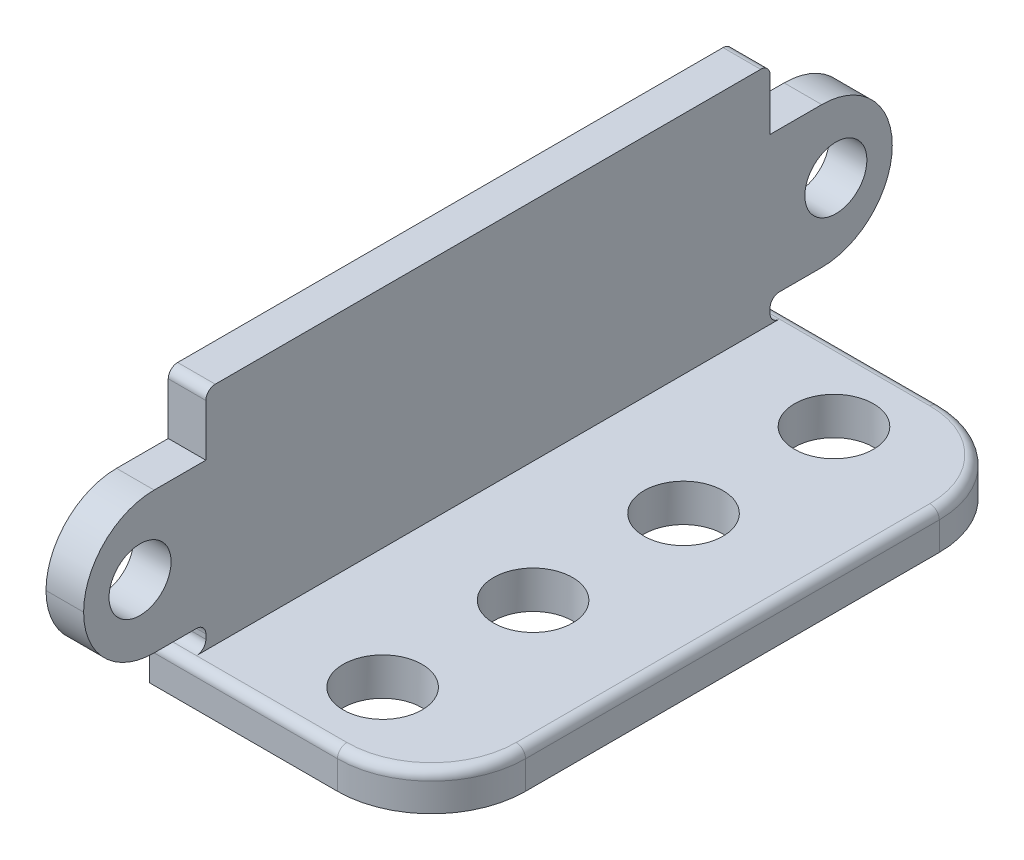
ISO-10303-21;
HEADER;
FILE_DESCRIPTION(('STEP AP214'),'2;1');
FILE_NAME('part.step','',(''),(''),'','','');
FILE_SCHEMA(('AUTOMOTIVE_DESIGN { 1 0 10303 214 1 1 1 1 }'));
ENDSEC;
DATA;
#1=APPLICATION_CONTEXT('core data for automotive mechanical design processes');
#2=APPLICATION_PROTOCOL_DEFINITION('international standard','automotive_design',2000,#1);
#3=PRODUCT_CONTEXT('',#1,'mechanical');
#4=PRODUCT('Part','Part','',(#3));
#5=PRODUCT_RELATED_PRODUCT_CATEGORY('part','',(#4));
#6=PRODUCT_DEFINITION_FORMATION('','',#4);
#7=PRODUCT_DEFINITION_CONTEXT('part definition',#1,'design');
#8=PRODUCT_DEFINITION('design','',#6,#7);
#9=PRODUCT_DEFINITION_SHAPE('','',#8);
#10=(LENGTH_UNIT() NAMED_UNIT(*) SI_UNIT(.MILLI.,.METRE.));
#11=(NAMED_UNIT(*) PLANE_ANGLE_UNIT() SI_UNIT($,.RADIAN.));
#12=(NAMED_UNIT(*) SI_UNIT($,.STERADIAN.) SOLID_ANGLE_UNIT());
#13=UNCERTAINTY_MEASURE_WITH_UNIT(LENGTH_MEASURE(1.E-05),#10,'distance_accuracy_value','');
#14=(GEOMETRIC_REPRESENTATION_CONTEXT(3) GLOBAL_UNCERTAINTY_ASSIGNED_CONTEXT((#13)) GLOBAL_UNIT_ASSIGNED_CONTEXT((#10,
#11,#12)) REPRESENTATION_CONTEXT('',''));
#15=CARTESIAN_POINT('',(0.,0.,0.));
#16=DIRECTION('',(0.,0.,1.));
#17=DIRECTION('',(1.,0.,0.));
#18=AXIS2_PLACEMENT_3D('',#15,#16,#17);
#19=CARTESIAN_POINT('',(2.,3.75,21.5));
#20=DIRECTION('',(0.,-1.,0.));
#21=DIRECTION('',(0.,0.,-1.));
#22=AXIS2_PLACEMENT_3D('',#19,#20,#21);
#23=PLANE('',#22);
#24=DIRECTION('',(0.,0.,1.));
#25=VECTOR('',#24,1.);
#26=CARTESIAN_POINT('',(0.,3.75,21.5));
#27=LINE('',#26,#25);
#28=CARTESIAN_POINT('',(0.,3.75,-17.75));
#29=VERTEX_POINT('',#28);
#30=CARTESIAN_POINT('',(0.,3.75,-15.));
#31=VERTEX_POINT('',#30);
#32=EDGE_CURVE('E332',#29,#31,#27,.T.);
#33=ORIENTED_EDGE('',*,*,#32,.T.);
#34=DIRECTION('',(1.,0.,0.));
#35=VECTOR('',#34,1.);
#36=CARTESIAN_POINT('',(2.,3.75,-15.));
#37=LINE('',#36,#35);
#38=CARTESIAN_POINT('',(2.,3.75,-15.));
#39=VERTEX_POINT('',#38);
#40=EDGE_CURVE('E305',#31,#39,#37,.T.);
#41=ORIENTED_EDGE('',*,*,#40,.T.);
#42=DIRECTION('',(0.,0.,1.));
#43=VECTOR('',#42,1.);
#44=CARTESIAN_POINT('',(2.,3.75,21.5));
#45=LINE('',#44,#43);
#46=CARTESIAN_POINT('',(2.,3.75,-17.75));
#47=VERTEX_POINT('',#46);
#48=EDGE_CURVE('E321',#47,#39,#45,.T.);
#49=ORIENTED_EDGE('',*,*,#48,.F.);
#50=DIRECTION('',(-1.,0.,0.));
#51=VECTOR('',#50,1.);
#52=CARTESIAN_POINT('',(2.,3.75,-17.75));
#53=LINE('',#52,#51);
#54=EDGE_CURVE('E385',#47,#29,#53,.T.);
#55=ORIENTED_EDGE('',*,*,#54,.T.);
#56=EDGE_LOOP('',(#33,#41,#49,#55));
#57=FACE_BOUND('',#56,.T.);
#58=ADVANCED_FACE('F39',(#57),#23,.F.);
#59=CARTESIAN_POINT('',(2.,-3.75,21.5));
#60=DIRECTION('',(0.,1.,0.));
#61=DIRECTION('',(0.,0.,1.));
#62=AXIS2_PLACEMENT_3D('',#59,#60,#61);
#63=PLANE('',#62);
#64=DIRECTION('',(0.,0.,-1.));
#65=VECTOR('',#64,1.);
#66=CARTESIAN_POINT('',(2.,-3.75,21.5));
#67=LINE('',#66,#65);
#68=CARTESIAN_POINT('',(2.,-3.75,-15.5));
#69=VERTEX_POINT('',#68);
#70=CARTESIAN_POINT('',(2.,-3.75,-17.75));
#71=VERTEX_POINT('',#70);
#72=EDGE_CURVE('E325',#69,#71,#67,.T.);
#73=ORIENTED_EDGE('',*,*,#72,.F.);
#74=DIRECTION('',(-1.,0.,0.));
#75=VECTOR('',#74,1.);
#76=CARTESIAN_POINT('',(2.,-3.75,-15.5));
#77=LINE('',#76,#75);
#78=CARTESIAN_POINT('',(0.,-3.75,-15.5));
#79=VERTEX_POINT('',#78);
#80=EDGE_CURVE('E426',#69,#79,#77,.T.);
#81=ORIENTED_EDGE('',*,*,#80,.T.);
#82=DIRECTION('',(0.,0.,-1.));
#83=VECTOR('',#82,1.);
#84=CARTESIAN_POINT('',(0.,-3.75,21.5));
#85=LINE('',#84,#83);
#86=CARTESIAN_POINT('',(0.,-3.75,-17.75));
#87=VERTEX_POINT('',#86);
#88=EDGE_CURVE('E336',#79,#87,#85,.T.);
#89=ORIENTED_EDGE('',*,*,#88,.T.);
#90=DIRECTION('',(-1.,0.,0.));
#91=VECTOR('',#90,1.);
#92=CARTESIAN_POINT('',(2.,-3.75,-17.75));
#93=LINE('',#92,#91);
#94=EDGE_CURVE('E365',#87,#71,#93,.F.);
#95=ORIENTED_EDGE('',*,*,#94,.T.);
#96=EDGE_LOOP('',(#73,#81,#89,#95));
#97=FACE_BOUND('',#96,.T.);
#98=ADVANCED_FACE('F664',(#97),#63,.F.);
#99=CARTESIAN_POINT('',(2.,3.75,15.));
#100=VERTEX_POINT('',#99);
#101=CARTESIAN_POINT('',(2.,3.75,17.75));
#102=VERTEX_POINT('',#101);
#103=EDGE_CURVE('E326',#100,#102,#45,.T.);
#104=ORIENTED_EDGE('',*,*,#103,.F.);
#105=DIRECTION('',(-1.,0.,0.));
#106=VECTOR('',#105,1.);
#107=CARTESIAN_POINT('',(2.,3.75,15.));
#108=LINE('',#107,#106);
#109=CARTESIAN_POINT('',(0.,3.75,15.));
#110=VERTEX_POINT('',#109);
#111=EDGE_CURVE('E291',#100,#110,#108,.T.);
#112=ORIENTED_EDGE('',*,*,#111,.T.);
#113=CARTESIAN_POINT('',(0.,3.75,17.75));
#114=VERTEX_POINT('',#113);
#115=EDGE_CURVE('E337',#110,#114,#27,.T.);
#116=ORIENTED_EDGE('',*,*,#115,.T.);
#117=DIRECTION('',(-1.,0.,0.));
#118=VECTOR('',#117,1.);
#119=CARTESIAN_POINT('',(2.,3.75,17.75));
#120=LINE('',#119,#118);
#121=EDGE_CURVE('E381',#114,#102,#120,.F.);
#122=ORIENTED_EDGE('',*,*,#121,.T.);
#123=EDGE_LOOP('',(#104,#112,#116,#122));
#124=FACE_BOUND('',#123,.T.);
#125=ADVANCED_FACE('F658',(#124),#23,.F.);
#126=CARTESIAN_POINT('',(0.,-3.75,17.75));
#127=VERTEX_POINT('',#126);
#128=CARTESIAN_POINT('',(0.,-3.75,15.5));
#129=VERTEX_POINT('',#128);
#130=EDGE_CURVE('E338',#127,#129,#85,.T.);
#131=ORIENTED_EDGE('',*,*,#130,.T.);
#132=DIRECTION('',(1.,0.,0.));
#133=VECTOR('',#132,1.);
#134=CARTESIAN_POINT('',(2.,-3.75,15.5));
#135=LINE('',#134,#133);
#136=CARTESIAN_POINT('',(2.,-3.75,15.5));
#137=VERTEX_POINT('',#136);
#138=EDGE_CURVE('E430',#129,#137,#135,.T.);
#139=ORIENTED_EDGE('',*,*,#138,.T.);
#140=CARTESIAN_POINT('',(2.,-3.75,17.75));
#141=VERTEX_POINT('',#140);
#142=EDGE_CURVE('E327',#141,#137,#67,.T.);
#143=ORIENTED_EDGE('',*,*,#142,.F.);
#144=DIRECTION('',(-1.,0.,0.));
#145=VECTOR('',#144,1.);
#146=CARTESIAN_POINT('',(2.,-3.75,17.75));
#147=LINE('',#146,#145);
#148=EDGE_CURVE('E361',#141,#127,#147,.T.);
#149=ORIENTED_EDGE('',*,*,#148,.T.);
#150=EDGE_LOOP('',(#131,#139,#143,#149));
#151=FACE_BOUND('',#150,.T.);
#152=ADVANCED_FACE('F645',(#151),#63,.F.);
#153=CARTESIAN_POINT('',(2.,0.,0.));
#154=DIRECTION('',(1.,0.,0.));
#155=DIRECTION('',(0.,0.,-1.));
#156=AXIS2_PLACEMENT_3D('',#153,#154,#155);
#157=PLANE('',#156);
#158=DIRECTION('',(0.,0.,-1.));
#159=VECTOR('',#158,1.);
#160=CARTESIAN_POINT('',(2.,7.,15.));
#161=LINE('',#160,#159);
#162=CARTESIAN_POINT('',(2.,7.,14.5));
#163=VERTEX_POINT('',#162);
#164=CARTESIAN_POINT('',(2.,7.,-14.5));
#165=VERTEX_POINT('',#164);
#166=EDGE_CURVE('E288',#163,#165,#161,.T.);
#167=ORIENTED_EDGE('',*,*,#166,.F.);
#168=CARTESIAN_POINT('',(2.,6.5,14.5));
#169=DIRECTION('',(1.,0.,0.));
#170=DIRECTION('',(0.,0.,-1.));
#171=AXIS2_PLACEMENT_3D('',#168,#169,#170);
#172=CIRCLE('',#171,0.5);
#173=CARTESIAN_POINT('',(2.,6.5,15.));
#174=VERTEX_POINT('',#173);
#175=EDGE_CURVE('E48',#163,#174,#172,.T.);
#176=ORIENTED_EDGE('',*,*,#175,.T.);
#177=DIRECTION('',(0.,1.,0.));
#178=VECTOR('',#177,1.);
#179=CARTESIAN_POINT('',(2.,-7.,15.));
#180=LINE('',#179,#178);
#181=EDGE_CURVE('E282',#100,#174,#180,.T.);
#182=ORIENTED_EDGE('',*,*,#181,.F.);
#183=ORIENTED_EDGE('',*,*,#103,.T.);
#184=CARTESIAN_POINT('',(2.,0.,17.75));
#185=DIRECTION('',(1.,0.,0.));
#186=DIRECTION('',(0.,0.,-1.));
#187=AXIS2_PLACEMENT_3D('',#184,#185,#186);
#188=CIRCLE('',#187,3.75);
#189=CARTESIAN_POINT('',(2.,0.,21.5));
#190=VERTEX_POINT('',#189);
#191=EDGE_CURVE('E369',#102,#190,#188,.T.);
#192=ORIENTED_EDGE('',*,*,#191,.T.);
#193=CARTESIAN_POINT('',(2.,0.,17.75));
#194=DIRECTION('',(1.,0.,0.));
#195=DIRECTION('',(0.,0.,-1.));
#196=AXIS2_PLACEMENT_3D('',#193,#194,#195);
#197=CIRCLE('',#196,3.75);
#198=EDGE_CURVE('E372',#190,#141,#197,.T.);
#199=ORIENTED_EDGE('',*,*,#198,.T.);
#200=ORIENTED_EDGE('',*,*,#142,.T.);
#201=CARTESIAN_POINT('',(2.,-4.25,15.5));
#202=DIRECTION('',(1.,0.,0.));
#203=DIRECTION('',(0.,0.,-1.));
#204=AXIS2_PLACEMENT_3D('',#201,#202,#203);
#205=CIRCLE('',#204,0.5);
#206=CARTESIAN_POINT('',(2.,-4.25,15.));
#207=VERTEX_POINT('',#206);
#208=EDGE_CURVE('E452',#137,#207,#205,.F.);
#209=ORIENTED_EDGE('',*,*,#208,.T.);
#210=CARTESIAN_POINT('',(2.,-4.5,15.));
#211=VERTEX_POINT('',#210);
#212=EDGE_CURVE('E284',#211,#207,#180,.T.);
#213=ORIENTED_EDGE('',*,*,#212,.F.);
#214=CARTESIAN_POINT('',(2.,-4.5,15.5));
#215=DIRECTION('',(1.,0.,0.));
#216=DIRECTION('',(0.,0.,-1.));
#217=AXIS2_PLACEMENT_3D('',#214,#215,#216);
#218=CIRCLE('',#217,0.5);
#219=CARTESIAN_POINT('',(2.,-5.,15.5));
#220=VERTEX_POINT('',#219);
#221=EDGE_CURVE('E461',#211,#220,#218,.F.);
#222=ORIENTED_EDGE('',*,*,#221,.T.);
#223=DIRECTION('',(0.,0.,1.));
#224=VECTOR('',#223,1.);
#225=CARTESIAN_POINT('',(2.,-5.,0.));
#226=LINE('',#225,#224);
#227=CARTESIAN_POINT('',(2.,-5.,-15.5));
#228=VERTEX_POINT('',#227);
#229=EDGE_CURVE('E237',#228,#220,#226,.T.);
#230=ORIENTED_EDGE('',*,*,#229,.F.);
#231=CARTESIAN_POINT('',(2.,-4.5,-15.5));
#232=DIRECTION('',(1.,0.,0.));
#233=DIRECTION('',(0.,0.,-1.));
#234=AXIS2_PLACEMENT_3D('',#231,#232,#233);
#235=CIRCLE('',#234,0.5);
#236=CARTESIAN_POINT('',(2.,-4.5,-15.));
#237=VERTEX_POINT('',#236);
#238=EDGE_CURVE('E440',#228,#237,#235,.F.);
#239=ORIENTED_EDGE('',*,*,#238,.T.);
#240=DIRECTION('',(0.,-1.,0.));
#241=VECTOR('',#240,1.);
#242=CARTESIAN_POINT('',(2.,-7.,-15.));
#243=LINE('',#242,#241);
#244=CARTESIAN_POINT('',(2.,-4.25,-15.));
#245=VERTEX_POINT('',#244);
#246=EDGE_CURVE('E283',#245,#237,#243,.T.);
#247=ORIENTED_EDGE('',*,*,#246,.F.);
#248=CARTESIAN_POINT('',(2.,-4.25,-15.5));
#249=DIRECTION('',(1.,0.,0.));
#250=DIRECTION('',(0.,0.,-1.));
#251=AXIS2_PLACEMENT_3D('',#248,#249,#250);
#252=CIRCLE('',#251,0.5);
#253=EDGE_CURVE('E449',#245,#69,#252,.F.);
#254=ORIENTED_EDGE('',*,*,#253,.T.);
#255=ORIENTED_EDGE('',*,*,#72,.T.);
#256=CARTESIAN_POINT('',(2.,0.,-17.75));
#257=DIRECTION('',(1.,0.,0.));
#258=DIRECTION('',(0.,0.,-1.));
#259=AXIS2_PLACEMENT_3D('',#256,#257,#258);
#260=CIRCLE('',#259,3.75);
#261=CARTESIAN_POINT('',(2.,0.,-21.5));
#262=VERTEX_POINT('',#261);
#263=EDGE_CURVE('E378',#71,#262,#260,.T.);
#264=ORIENTED_EDGE('',*,*,#263,.T.);
#265=CARTESIAN_POINT('',(2.,0.,-17.75));
#266=DIRECTION('',(1.,0.,0.));
#267=DIRECTION('',(0.,0.,-1.));
#268=AXIS2_PLACEMENT_3D('',#265,#266,#267);
#269=CIRCLE('',#268,3.75);
#270=EDGE_CURVE('E375',#262,#47,#269,.T.);
#271=ORIENTED_EDGE('',*,*,#270,.T.);
#272=ORIENTED_EDGE('',*,*,#48,.T.);
#273=CARTESIAN_POINT('',(2.,6.5,-15.));
#274=VERTEX_POINT('',#273);
#275=EDGE_CURVE('E279',#274,#39,#243,.T.);
#276=ORIENTED_EDGE('',*,*,#275,.F.);
#277=CARTESIAN_POINT('',(2.,6.5,-14.5));
#278=DIRECTION('',(1.,0.,0.));
#279=DIRECTION('',(0.,0.,-1.));
#280=AXIS2_PLACEMENT_3D('',#277,#278,#279);
#281=CIRCLE('',#280,0.5);
#282=EDGE_CURVE('E60',#274,#165,#281,.T.);
#283=ORIENTED_EDGE('',*,*,#282,.T.);
#284=EDGE_LOOP('',(#167,#176,#182,#183,#192,#199,#200,#209,#213,#222,#230,#239,#247,#254,#255,
#264,#271,#272,#276,#283));
#285=FACE_BOUND('',#284,.T.);
#286=CARTESIAN_POINT('',(2.,0.,18.5));
#287=DIRECTION('',(1.,0.,0.));
#288=DIRECTION('',(0.,0.,-1.));
#289=AXIS2_PLACEMENT_3D('',#286,#287,#288);
#290=CIRCLE('',#289,1.65);
#291=CARTESIAN_POINT('',(2.,0.,16.85));
#292=VERTEX_POINT('',#291);
#293=EDGE_CURVE('E316',#292,#292,#290,.T.);
#294=ORIENTED_EDGE('',*,*,#293,.F.);
#295=EDGE_LOOP('',(#294));
#296=FACE_BOUND('',#295,.T.);
#297=CARTESIAN_POINT('',(2.,0.,-18.5));
#298=DIRECTION('',(1.,0.,0.));
#299=DIRECTION('',(0.,0.,-1.));
#300=AXIS2_PLACEMENT_3D('',#297,#298,#299);
#301=CIRCLE('',#300,1.65);
#302=CARTESIAN_POINT('',(2.,0.,-20.15));
#303=VERTEX_POINT('',#302);
#304=EDGE_CURVE('E310',#303,#303,#301,.T.);
#305=ORIENTED_EDGE('',*,*,#304,.F.);
#306=EDGE_LOOP('',(#305));
#307=FACE_BOUND('',#306,.T.);
#308=ADVANCED_FACE('F539',(#285,#296,#307),#157,.T.);
#309=CARTESIAN_POINT('',(0.,0.,0.));
#310=DIRECTION('',(1.,0.,0.));
#311=DIRECTION('',(0.,0.,-1.));
#312=AXIS2_PLACEMENT_3D('',#309,#310,#311);
#313=PLANE('',#312);
#314=CARTESIAN_POINT('',(0.,0.,18.5));
#315=DIRECTION('',(1.,0.,0.));
#316=DIRECTION('',(0.,0.,-1.));
#317=AXIS2_PLACEMENT_3D('',#314,#315,#316);
#318=CIRCLE('',#317,1.65);
#319=CARTESIAN_POINT('',(0.,0.,16.85));
#320=VERTEX_POINT('',#319);
#321=EDGE_CURVE('E320',#320,#320,#318,.T.);
#322=ORIENTED_EDGE('',*,*,#321,.T.);
#323=EDGE_LOOP('',(#322));
#324=FACE_BOUND('',#323,.T.);
#325=DIRECTION('',(0.,1.,0.));
#326=VECTOR('',#325,1.);
#327=CARTESIAN_POINT('',(0.,-7.,15.));
#328=LINE('',#327,#326);
#329=CARTESIAN_POINT('',(0.,6.5,15.));
#330=VERTEX_POINT('',#329);
#331=EDGE_CURVE('E250',#110,#330,#328,.T.);
#332=ORIENTED_EDGE('',*,*,#331,.T.);
#333=CARTESIAN_POINT('',(0.,6.5,14.5));
#334=DIRECTION('',(1.,0.,0.));
#335=DIRECTION('',(0.,0.,-1.));
#336=AXIS2_PLACEMENT_3D('',#333,#334,#335);
#337=CIRCLE('',#336,0.5);
#338=CARTESIAN_POINT('',(0.,7.,14.5));
#339=VERTEX_POINT('',#338);
#340=EDGE_CURVE('E524',#330,#339,#337,.F.);
#341=ORIENTED_EDGE('',*,*,#340,.T.);
#342=DIRECTION('',(0.,0.,-1.));
#343=VECTOR('',#342,1.);
#344=CARTESIAN_POINT('',(0.,7.,15.));
#345=LINE('',#344,#343);
#346=CARTESIAN_POINT('',(0.,7.,-14.5));
#347=VERTEX_POINT('',#346);
#348=EDGE_CURVE('E298',#339,#347,#345,.T.);
#349=ORIENTED_EDGE('',*,*,#348,.T.);
#350=CARTESIAN_POINT('',(0.,6.5,-14.5));
#351=DIRECTION('',(1.,0.,0.));
#352=DIRECTION('',(0.,0.,-1.));
#353=AXIS2_PLACEMENT_3D('',#350,#351,#352);
#354=CIRCLE('',#353,0.5);
#355=CARTESIAN_POINT('',(0.,6.5,-15.));
#356=VERTEX_POINT('',#355);
#357=EDGE_CURVE('E521',#347,#356,#354,.F.);
#358=ORIENTED_EDGE('',*,*,#357,.T.);
#359=DIRECTION('',(0.,-1.,0.));
#360=VECTOR('',#359,1.);
#361=CARTESIAN_POINT('',(0.,-7.,-15.));
#362=LINE('',#361,#360);
#363=EDGE_CURVE('E251',#356,#31,#362,.T.);
#364=ORIENTED_EDGE('',*,*,#363,.T.);
#365=ORIENTED_EDGE('',*,*,#32,.F.);
#366=CARTESIAN_POINT('',(0.,0.,-17.75));
#367=DIRECTION('',(1.,0.,0.));
#368=DIRECTION('',(0.,0.,-1.));
#369=AXIS2_PLACEMENT_3D('',#366,#367,#368);
#370=CIRCLE('',#369,3.75);
#371=CARTESIAN_POINT('',(0.,0.,-21.5));
#372=VERTEX_POINT('',#371);
#373=EDGE_CURVE('E354',#29,#372,#370,.F.);
#374=ORIENTED_EDGE('',*,*,#373,.T.);
#375=CARTESIAN_POINT('',(0.,0.,-17.75));
#376=DIRECTION('',(1.,0.,0.));
#377=DIRECTION('',(0.,0.,-1.));
#378=AXIS2_PLACEMENT_3D('',#375,#376,#377);
#379=CIRCLE('',#378,3.75);
#380=EDGE_CURVE('E357',#372,#87,#379,.F.);
#381=ORIENTED_EDGE('',*,*,#380,.T.);
#382=ORIENTED_EDGE('',*,*,#88,.F.);
#383=CARTESIAN_POINT('',(0.,-4.25,-15.5));
#384=DIRECTION('',(1.,0.,0.));
#385=DIRECTION('',(0.,0.,-1.));
#386=AXIS2_PLACEMENT_3D('',#383,#384,#385);
#387=CIRCLE('',#386,0.5);
#388=CARTESIAN_POINT('',(0.,-4.25,-15.));
#389=VERTEX_POINT('',#388);
#390=EDGE_CURVE('E446',#79,#389,#387,.T.);
#391=ORIENTED_EDGE('',*,*,#390,.T.);
#392=CARTESIAN_POINT('',(0.,-4.5,-15.));
#393=VERTEX_POINT('',#392);
#394=EDGE_CURVE('E278',#389,#393,#362,.T.);
#395=ORIENTED_EDGE('',*,*,#394,.T.);
#396=CARTESIAN_POINT('',(0.,-4.5,-15.5));
#397=DIRECTION('',(1.,0.,0.));
#398=DIRECTION('',(0.,0.,-1.));
#399=AXIS2_PLACEMENT_3D('',#396,#397,#398);
#400=CIRCLE('',#399,0.5);
#401=CARTESIAN_POINT('',(0.,-5.,-15.5));
#402=VERTEX_POINT('',#401);
#403=EDGE_CURVE('E443',#393,#402,#400,.T.);
#404=ORIENTED_EDGE('',*,*,#403,.T.);
#405=CARTESIAN_POINT('',(0.,-5.5,-15.5));
#406=DIRECTION('',(1.,0.,0.));
#407=DIRECTION('',(0.,0.,-1.));
#408=AXIS2_PLACEMENT_3D('',#405,#406,#407);
#409=CIRCLE('',#408,0.5);
#410=CARTESIAN_POINT('',(0.,-5.5,-16.));
#411=VERTEX_POINT('',#410);
#412=EDGE_CURVE('E482',#402,#411,#409,.F.);
#413=ORIENTED_EDGE('',*,*,#412,.T.);
#414=DIRECTION('',(0.,-1.,0.));
#415=VECTOR('',#414,1.);
#416=CARTESIAN_POINT('',(0.,-5.,-16.));
#417=LINE('',#416,#415);
#418=CARTESIAN_POINT('',(0.,-7.,-16.));
#419=VERTEX_POINT('',#418);
#420=EDGE_CURVE('E238',#411,#419,#417,.T.);
#421=ORIENTED_EDGE('',*,*,#420,.T.);
#422=DIRECTION('',(0.,0.,1.));
#423=VECTOR('',#422,1.);
#424=CARTESIAN_POINT('',(0.,-7.,15.));
#425=LINE('',#424,#423);
#426=CARTESIAN_POINT('',(0.,-7.,16.));
#427=VERTEX_POINT('',#426);
#428=EDGE_CURVE('E241',#419,#427,#425,.T.);
#429=ORIENTED_EDGE('',*,*,#428,.T.);
#430=DIRECTION('',(0.,-1.,0.));
#431=VECTOR('',#430,1.);
#432=CARTESIAN_POINT('',(0.,-5.,16.));
#433=LINE('',#432,#431);
#434=CARTESIAN_POINT('',(0.,-5.5,16.));
#435=VERTEX_POINT('',#434);
#436=EDGE_CURVE('E225',#435,#427,#433,.T.);
#437=ORIENTED_EDGE('',*,*,#436,.F.);
#438=CARTESIAN_POINT('',(0.,-5.5,15.5));
#439=DIRECTION('',(1.,0.,0.));
#440=DIRECTION('',(0.,0.,-1.));
#441=AXIS2_PLACEMENT_3D('',#438,#439,#440);
#442=CIRCLE('',#441,0.5);
#443=CARTESIAN_POINT('',(0.,-5.,15.5));
#444=VERTEX_POINT('',#443);
#445=EDGE_CURVE('E485',#435,#444,#442,.F.);
#446=ORIENTED_EDGE('',*,*,#445,.T.);
#447=CARTESIAN_POINT('',(0.,-4.5,15.5));
#448=DIRECTION('',(1.,0.,0.));
#449=DIRECTION('',(0.,0.,-1.));
#450=AXIS2_PLACEMENT_3D('',#447,#448,#449);
#451=CIRCLE('',#450,0.5);
#452=CARTESIAN_POINT('',(0.,-4.5,15.));
#453=VERTEX_POINT('',#452);
#454=EDGE_CURVE('E458',#444,#453,#451,.T.);
#455=ORIENTED_EDGE('',*,*,#454,.T.);
#456=CARTESIAN_POINT('',(0.,-4.25,15.));
#457=VERTEX_POINT('',#456);
#458=EDGE_CURVE('E294',#453,#457,#328,.T.);
#459=ORIENTED_EDGE('',*,*,#458,.T.);
#460=CARTESIAN_POINT('',(0.,-4.25,15.5));
#461=DIRECTION('',(1.,0.,0.));
#462=DIRECTION('',(0.,0.,-1.));
#463=AXIS2_PLACEMENT_3D('',#460,#461,#462);
#464=CIRCLE('',#463,0.5);
#465=EDGE_CURVE('E455',#457,#129,#464,.T.);
#466=ORIENTED_EDGE('',*,*,#465,.T.);
#467=ORIENTED_EDGE('',*,*,#130,.F.);
#468=CARTESIAN_POINT('',(0.,0.,17.75));
#469=DIRECTION('',(1.,0.,0.));
#470=DIRECTION('',(0.,0.,-1.));
#471=AXIS2_PLACEMENT_3D('',#468,#469,#470);
#472=CIRCLE('',#471,3.75);
#473=CARTESIAN_POINT('',(0.,0.,21.5));
#474=VERTEX_POINT('',#473);
#475=EDGE_CURVE('E351',#127,#474,#472,.F.);
#476=ORIENTED_EDGE('',*,*,#475,.T.);
#477=CARTESIAN_POINT('',(0.,0.,17.75));
#478=DIRECTION('',(1.,0.,0.));
#479=DIRECTION('',(0.,0.,-1.));
#480=AXIS2_PLACEMENT_3D('',#477,#478,#479);
#481=CIRCLE('',#480,3.75);
#482=EDGE_CURVE('E331',#474,#114,#481,.F.);
#483=ORIENTED_EDGE('',*,*,#482,.T.);
#484=ORIENTED_EDGE('',*,*,#115,.F.);
#485=EDGE_LOOP('',(#332,#341,#349,#358,#364,#365,#374,#381,#382,#391,#395,#404,#413,#421,#429,
#437,#446,#455,#459,#466,#467,#476,#483,#484));
#486=FACE_BOUND('',#485,.T.);
#487=CARTESIAN_POINT('',(0.,0.,-18.5));
#488=DIRECTION('',(1.,0.,0.));
#489=DIRECTION('',(0.,0.,-1.));
#490=AXIS2_PLACEMENT_3D('',#487,#488,#489);
#491=CIRCLE('',#490,1.65);
#492=CARTESIAN_POINT('',(0.,0.,-20.15));
#493=VERTEX_POINT('',#492);
#494=EDGE_CURVE('E314',#493,#493,#491,.T.);
#495=ORIENTED_EDGE('',*,*,#494,.T.);
#496=EDGE_LOOP('',(#495));
#497=FACE_BOUND('',#496,.T.);
#498=ADVANCED_FACE('F243',(#324,#486,#497),#313,.F.);
#499=CARTESIAN_POINT('',(-9.5,0.,18.5));
#500=DIRECTION('',(1.,0.,0.));
#501=DIRECTION('',(0.,0.,-1.));
#502=AXIS2_PLACEMENT_3D('',#499,#500,#501);
#503=CYLINDRICAL_SURFACE('',#502,1.65);
#504=ORIENTED_EDGE('',*,*,#293,.T.);
#505=EDGE_LOOP('',(#504));
#506=FACE_BOUND('',#505,.T.);
#507=ORIENTED_EDGE('',*,*,#321,.F.);
#508=EDGE_LOOP('',(#507));
#509=FACE_BOUND('',#508,.T.);
#510=ADVANCED_FACE('F694',(#506,#509),#503,.F.);
#511=CARTESIAN_POINT('',(-9.5,0.,-18.5));
#512=DIRECTION('',(1.,0.,0.));
#513=DIRECTION('',(0.,0.,-1.));
#514=AXIS2_PLACEMENT_3D('',#511,#512,#513);
#515=CYLINDRICAL_SURFACE('',#514,1.65);
#516=ORIENTED_EDGE('',*,*,#304,.T.);
#517=EDGE_LOOP('',(#516));
#518=FACE_BOUND('',#517,.T.);
#519=ORIENTED_EDGE('',*,*,#494,.F.);
#520=EDGE_LOOP('',(#519));
#521=FACE_BOUND('',#520,.T.);
#522=ADVANCED_FACE('F698',(#518,#521),#515,.F.);
#523=CARTESIAN_POINT('',(2.,0.,-17.75));
#524=DIRECTION('',(-1.,0.,0.));
#525=DIRECTION('',(0.,0.,1.));
#526=AXIS2_PLACEMENT_3D('',#523,#524,#525);
#527=CYLINDRICAL_SURFACE('',#526,3.75);
#528=ORIENTED_EDGE('',*,*,#54,.F.);
#529=ORIENTED_EDGE('',*,*,#270,.F.);
#530=DIRECTION('',(-1.,0.,0.));
#531=VECTOR('',#530,1.);
#532=CARTESIAN_POINT('',(2.,0.,-21.5));
#533=LINE('',#532,#531);
#534=EDGE_CURVE('E315',#372,#262,#533,.F.);
#535=ORIENTED_EDGE('',*,*,#534,.F.);
#536=ORIENTED_EDGE('',*,*,#373,.F.);
#537=EDGE_LOOP('',(#528,#529,#535,#536));
#538=FACE_BOUND('',#537,.T.);
#539=ADVANCED_FACE('F565',(#538),#527,.T.);
#540=CARTESIAN_POINT('',(2.,0.,-17.75));
#541=DIRECTION('',(-1.,0.,0.));
#542=DIRECTION('',(0.,0.,1.));
#543=AXIS2_PLACEMENT_3D('',#540,#541,#542);
#544=CYLINDRICAL_SURFACE('',#543,3.75);
#545=ORIENTED_EDGE('',*,*,#263,.F.);
#546=ORIENTED_EDGE('',*,*,#94,.F.);
#547=ORIENTED_EDGE('',*,*,#380,.F.);
#548=ORIENTED_EDGE('',*,*,#534,.T.);
#549=EDGE_LOOP('',(#545,#546,#547,#548));
#550=FACE_BOUND('',#549,.T.);
#551=ADVANCED_FACE('F569',(#550),#544,.T.);
#552=CARTESIAN_POINT('',(2.,0.,17.75));
#553=DIRECTION('',(-1.,0.,0.));
#554=DIRECTION('',(0.,0.,1.));
#555=AXIS2_PLACEMENT_3D('',#552,#553,#554);
#556=CYLINDRICAL_SURFACE('',#555,3.75);
#557=DIRECTION('',(-1.,0.,0.));
#558=VECTOR('',#557,1.);
#559=CARTESIAN_POINT('',(2.,0.,21.5));
#560=LINE('',#559,#558);
#561=EDGE_CURVE('E309',#190,#474,#560,.T.);
#562=ORIENTED_EDGE('',*,*,#561,.F.);
#563=ORIENTED_EDGE('',*,*,#191,.F.);
#564=ORIENTED_EDGE('',*,*,#121,.F.);
#565=ORIENTED_EDGE('',*,*,#482,.F.);
#566=EDGE_LOOP('',(#562,#563,#564,#565));
#567=FACE_BOUND('',#566,.T.);
#568=ADVANCED_FACE('F655',(#567),#556,.T.);
#569=CARTESIAN_POINT('',(2.,0.,17.75));
#570=DIRECTION('',(-1.,0.,0.));
#571=DIRECTION('',(0.,0.,1.));
#572=AXIS2_PLACEMENT_3D('',#569,#570,#571);
#573=CYLINDRICAL_SURFACE('',#572,3.75);
#574=ORIENTED_EDGE('',*,*,#198,.F.);
#575=ORIENTED_EDGE('',*,*,#561,.T.);
#576=ORIENTED_EDGE('',*,*,#475,.F.);
#577=ORIENTED_EDGE('',*,*,#148,.F.);
#578=EDGE_LOOP('',(#574,#575,#576,#577));
#579=FACE_BOUND('',#578,.T.);
#580=ADVANCED_FACE('F650',(#579),#573,.T.);
#581=CARTESIAN_POINT('',(2.,-7.,15.));
#582=DIRECTION('',(0.,-1.,0.));
#583=DIRECTION('',(0.,0.,-1.));
#584=AXIS2_PLACEMENT_3D('',#581,#582,#583);
#585=PLANE('',#584);
#586=CARTESIAN_POINT('',(8.39999999999975,-7.,-12.));
#587=DIRECTION('',(0.,-1.,0.));
#588=DIRECTION('',(0.,0.,-1.));
#589=AXIS2_PLACEMENT_3D('',#586,#587,#588);
#590=CIRCLE('',#589,2.1);
#591=CARTESIAN_POINT('',(8.39999999999975,-7.,-14.1));
#592=VERTEX_POINT('',#591);
#593=EDGE_CURVE('E1028',#592,#592,#590,.T.);
#594=ORIENTED_EDGE('',*,*,#593,.F.);
#595=EDGE_LOOP('',(#594));
#596=FACE_BOUND('',#595,.T.);
#597=CARTESIAN_POINT('',(8.39999999999983,-7.,-4.));
#598=DIRECTION('',(0.,-1.,0.));
#599=DIRECTION('',(0.,0.,-1.));
#600=AXIS2_PLACEMENT_3D('',#597,#598,#599);
#601=CIRCLE('',#600,2.1);
#602=CARTESIAN_POINT('',(8.39999999999983,-7.,-6.1));
#603=VERTEX_POINT('',#602);
#604=EDGE_CURVE('E1020',#603,#603,#601,.T.);
#605=ORIENTED_EDGE('',*,*,#604,.F.);
#606=EDGE_LOOP('',(#605));
#607=FACE_BOUND('',#606,.T.);
#608=CARTESIAN_POINT('',(8.39999999999992,-7.,4.));
#609=DIRECTION('',(0.,-1.,0.));
#610=DIRECTION('',(0.,0.,-1.));
#611=AXIS2_PLACEMENT_3D('',#608,#609,#610);
#612=CIRCLE('',#611,2.1);
#613=CARTESIAN_POINT('',(8.39999999999992,-7.,1.9));
#614=VERTEX_POINT('',#613);
#615=EDGE_CURVE('E1011',#614,#614,#612,.T.);
#616=ORIENTED_EDGE('',*,*,#615,.F.);
#617=EDGE_LOOP('',(#616));
#618=FACE_BOUND('',#617,.T.);
#619=CARTESIAN_POINT('',(8.4,-7.,12.));
#620=DIRECTION('',(0.,-1.,0.));
#621=DIRECTION('',(0.,0.,-1.));
#622=AXIS2_PLACEMENT_3D('',#619,#620,#621);
#623=CIRCLE('',#622,2.1);
#624=CARTESIAN_POINT('',(8.4,-7.,9.9));
#625=VERTEX_POINT('',#624);
#626=EDGE_CURVE('E259',#625,#625,#623,.T.);
#627=ORIENTED_EDGE('',*,*,#626,.F.);
#628=EDGE_LOOP('',(#627));
#629=FACE_BOUND('',#628,.T.);
#630=DIRECTION('',(-1.,0.,0.));
#631=VECTOR('',#630,1.);
#632=CARTESIAN_POINT('',(0.,-7.,-16.));
#633=LINE('',#632,#631);
#634=CARTESIAN_POINT('',(10.,-7.,-16.));
#635=VERTEX_POINT('',#634);
#636=EDGE_CURVE('E264',#635,#419,#633,.T.);
#637=ORIENTED_EDGE('',*,*,#636,.F.);
#638=CARTESIAN_POINT('',(10.,-7.,-11.));
#639=DIRECTION('',(0.,-1.,0.));
#640=DIRECTION('',(0.,0.,-1.));
#641=AXIS2_PLACEMENT_3D('',#638,#639,#640);
#642=CIRCLE('',#641,5.);
#643=CARTESIAN_POINT('',(15.,-7.,-11.));
#644=VERTEX_POINT('',#643);
#645=EDGE_CURVE('E399',#635,#644,#642,.T.);
#646=ORIENTED_EDGE('',*,*,#645,.T.);
#647=DIRECTION('',(0.,0.,-1.));
#648=VECTOR('',#647,1.);
#649=CARTESIAN_POINT('',(15.,-7.,-16.));
#650=LINE('',#649,#648);
#651=CARTESIAN_POINT('',(15.,-7.,11.));
#652=VERTEX_POINT('',#651);
#653=EDGE_CURVE('E258',#652,#644,#650,.T.);
#654=ORIENTED_EDGE('',*,*,#653,.F.);
#655=CARTESIAN_POINT('',(10.,-7.,11.));
#656=DIRECTION('',(0.,-1.,0.));
#657=DIRECTION('',(0.,0.,-1.));
#658=AXIS2_PLACEMENT_3D('',#655,#656,#657);
#659=CIRCLE('',#658,5.);
#660=CARTESIAN_POINT('',(10.,-7.,16.));
#661=VERTEX_POINT('',#660);
#662=EDGE_CURVE('E256',#652,#661,#659,.T.);
#663=ORIENTED_EDGE('',*,*,#662,.T.);
#664=DIRECTION('',(1.,0.,0.));
#665=VECTOR('',#664,1.);
#666=CARTESIAN_POINT('',(0.,-7.,16.));
#667=LINE('',#666,#665);
#668=EDGE_CURVE('E230',#427,#661,#667,.T.);
#669=ORIENTED_EDGE('',*,*,#668,.F.);
#670=ORIENTED_EDGE('',*,*,#428,.F.);
#671=EDGE_LOOP('',(#637,#646,#654,#663,#669,#670));
#672=FACE_BOUND('',#671,.T.);
#673=ADVANCED_FACE('F253',(#596,#607,#618,#629,#672),#585,.T.);
#674=CARTESIAN_POINT('',(2.,-7.,15.));
#675=DIRECTION('',(0.,0.,1.));
#676=DIRECTION('',(1.,0.,0.));
#677=AXIS2_PLACEMENT_3D('',#674,#675,#676);
#678=PLANE('',#677);
#679=ORIENTED_EDGE('',*,*,#212,.T.);
#680=DIRECTION('',(1.,0.,0.));
#681=VECTOR('',#680,1.);
#682=CARTESIAN_POINT('',(2.,-4.25,15.));
#683=LINE('',#682,#681);
#684=EDGE_CURVE('E437',#207,#457,#683,.F.);
#685=ORIENTED_EDGE('',*,*,#684,.T.);
#686=ORIENTED_EDGE('',*,*,#458,.F.);
#687=DIRECTION('',(-1.,0.,0.));
#688=VECTOR('',#687,1.);
#689=CARTESIAN_POINT('',(2.,-4.5,15.));
#690=LINE('',#689,#688);
#691=EDGE_CURVE('E434',#453,#211,#690,.F.);
#692=ORIENTED_EDGE('',*,*,#691,.T.);
#693=EDGE_LOOP('',(#679,#685,#686,#692));
#694=FACE_BOUND('',#693,.T.);
#695=ADVANCED_FACE('F637',(#694),#678,.T.);
#696=CARTESIAN_POINT('',(2.,-7.,-15.));
#697=DIRECTION('',(0.,0.,-1.));
#698=DIRECTION('',(-1.,0.,0.));
#699=AXIS2_PLACEMENT_3D('',#696,#697,#698);
#700=PLANE('',#699);
#701=ORIENTED_EDGE('',*,*,#246,.T.);
#702=DIRECTION('',(1.,0.,0.));
#703=VECTOR('',#702,1.);
#704=CARTESIAN_POINT('',(0.,-4.5,-15.));
#705=LINE('',#704,#703);
#706=EDGE_CURVE('E423',#237,#393,#705,.F.);
#707=ORIENTED_EDGE('',*,*,#706,.T.);
#708=ORIENTED_EDGE('',*,*,#394,.F.);
#709=DIRECTION('',(-1.,0.,0.));
#710=VECTOR('',#709,1.);
#711=CARTESIAN_POINT('',(2.,-4.25,-15.));
#712=LINE('',#711,#710);
#713=EDGE_CURVE('E420',#389,#245,#712,.F.);
#714=ORIENTED_EDGE('',*,*,#713,.T.);
#715=EDGE_LOOP('',(#701,#707,#708,#714));
#716=FACE_BOUND('',#715,.T.);
#717=ADVANCED_FACE('F667',(#716),#700,.T.);
#718=ORIENTED_EDGE('',*,*,#363,.F.);
#719=DIRECTION('',(-1.,0.,0.));
#720=VECTOR('',#719,1.);
#721=CARTESIAN_POINT('',(2.,6.5,-15.));
#722=LINE('',#721,#720);
#723=EDGE_CURVE('E11',#356,#274,#722,.F.);
#724=ORIENTED_EDGE('',*,*,#723,.T.);
#725=ORIENTED_EDGE('',*,*,#275,.T.);
#726=ORIENTED_EDGE('',*,*,#40,.F.);
#727=EDGE_LOOP('',(#718,#724,#725,#726));
#728=FACE_BOUND('',#727,.T.);
#729=ADVANCED_FACE('F557',(#728),#700,.T.);
#730=ORIENTED_EDGE('',*,*,#181,.T.);
#731=DIRECTION('',(-1.,0.,0.));
#732=VECTOR('',#731,1.);
#733=CARTESIAN_POINT('',(2.,6.5,15.));
#734=LINE('',#733,#732);
#735=EDGE_CURVE('E500',#174,#330,#734,.T.);
#736=ORIENTED_EDGE('',*,*,#735,.T.);
#737=ORIENTED_EDGE('',*,*,#331,.F.);
#738=ORIENTED_EDGE('',*,*,#111,.F.);
#739=EDGE_LOOP('',(#730,#736,#737,#738));
#740=FACE_BOUND('',#739,.T.);
#741=ADVANCED_FACE('F546',(#740),#678,.T.);
#742=CARTESIAN_POINT('',(2.,7.,15.));
#743=DIRECTION('',(0.,1.,0.));
#744=DIRECTION('',(0.,0.,1.));
#745=AXIS2_PLACEMENT_3D('',#742,#743,#744);
#746=PLANE('',#745);
#747=ORIENTED_EDGE('',*,*,#348,.F.);
#748=DIRECTION('',(-1.,0.,0.));
#749=VECTOR('',#748,1.);
#750=CARTESIAN_POINT('',(2.,7.,14.5));
#751=LINE('',#750,#749);
#752=EDGE_CURVE('E531',#339,#163,#751,.F.);
#753=ORIENTED_EDGE('',*,*,#752,.T.);
#754=ORIENTED_EDGE('',*,*,#166,.T.);
#755=DIRECTION('',(-1.,0.,0.));
#756=VECTOR('',#755,1.);
#757=CARTESIAN_POINT('',(2.,7.,-14.5));
#758=LINE('',#757,#756);
#759=EDGE_CURVE('E527',#165,#347,#758,.T.);
#760=ORIENTED_EDGE('',*,*,#759,.T.);
#761=EDGE_LOOP('',(#747,#753,#754,#760));
#762=FACE_BOUND('',#761,.T.);
#763=ADVANCED_FACE('F552',(#762),#746,.T.);
#764=CARTESIAN_POINT('',(0.,-5.,16.));
#765=DIRECTION('',(0.,0.,-1.));
#766=DIRECTION('',(-1.,0.,0.));
#767=AXIS2_PLACEMENT_3D('',#764,#765,#766);
#768=PLANE('',#767);
#769=DIRECTION('',(0.,-1.,0.));
#770=VECTOR('',#769,1.);
#771=CARTESIAN_POINT('',(10.,-5.,16.));
#772=LINE('',#771,#770);
#773=CARTESIAN_POINT('',(10.,-5.5,16.));
#774=VERTEX_POINT('',#773);
#775=EDGE_CURVE('E409',#661,#774,#772,.F.);
#776=ORIENTED_EDGE('',*,*,#775,.T.);
#777=DIRECTION('',(1.,0.,0.));
#778=VECTOR('',#777,1.);
#779=CARTESIAN_POINT('',(0.,-5.5,16.));
#780=LINE('',#779,#778);
#781=EDGE_CURVE('E233',#774,#435,#780,.F.);
#782=ORIENTED_EDGE('',*,*,#781,.T.);
#783=ORIENTED_EDGE('',*,*,#436,.T.);
#784=ORIENTED_EDGE('',*,*,#668,.T.);
#785=EDGE_LOOP('',(#776,#782,#783,#784));
#786=FACE_BOUND('',#785,.T.);
#787=ADVANCED_FACE('F228',(#786),#768,.F.);
#788=CARTESIAN_POINT('',(15.,-5.,-16.));
#789=DIRECTION('',(-1.,0.,0.));
#790=DIRECTION('',(0.,0.,1.));
#791=AXIS2_PLACEMENT_3D('',#788,#789,#790);
#792=PLANE('',#791);
#793=DIRECTION('',(0.,-1.,0.));
#794=VECTOR('',#793,1.);
#795=CARTESIAN_POINT('',(15.,-5.,-11.));
#796=LINE('',#795,#794);
#797=CARTESIAN_POINT('',(15.,-5.5,-11.));
#798=VERTEX_POINT('',#797);
#799=EDGE_CURVE('E405',#644,#798,#796,.F.);
#800=ORIENTED_EDGE('',*,*,#799,.T.);
#801=DIRECTION('',(0.,0.,-1.));
#802=VECTOR('',#801,1.);
#803=CARTESIAN_POINT('',(15.,-5.5,11.));
#804=LINE('',#803,#802);
#805=CARTESIAN_POINT('',(15.,-5.5,11.));
#806=VERTEX_POINT('',#805);
#807=EDGE_CURVE('E491',#798,#806,#804,.F.);
#808=ORIENTED_EDGE('',*,*,#807,.T.);
#809=DIRECTION('',(0.,-1.,0.));
#810=VECTOR('',#809,1.);
#811=CARTESIAN_POINT('',(15.,-5.,11.));
#812=LINE('',#811,#810);
#813=EDGE_CURVE('E402',#806,#652,#812,.T.);
#814=ORIENTED_EDGE('',*,*,#813,.T.);
#815=ORIENTED_EDGE('',*,*,#653,.T.);
#816=EDGE_LOOP('',(#800,#808,#814,#815));
#817=FACE_BOUND('',#816,.T.);
#818=ADVANCED_FACE('F603',(#817),#792,.F.);
#819=CARTESIAN_POINT('',(0.,-5.,-16.));
#820=DIRECTION('',(0.,0.,1.));
#821=DIRECTION('',(0.,-1.,0.));
#822=AXIS2_PLACEMENT_3D('',#819,#820,#821);
#823=PLANE('',#822);
#824=ORIENTED_EDGE('',*,*,#420,.F.);
#825=DIRECTION('',(-1.,0.,0.));
#826=VECTOR('',#825,1.);
#827=CARTESIAN_POINT('',(10.,-5.5,-16.));
#828=LINE('',#827,#826);
#829=CARTESIAN_POINT('',(10.,-5.5,-16.));
#830=VERTEX_POINT('',#829);
#831=EDGE_CURVE('E497',#411,#830,#828,.F.);
#832=ORIENTED_EDGE('',*,*,#831,.T.);
#833=DIRECTION('',(0.,-1.,0.));
#834=VECTOR('',#833,1.);
#835=CARTESIAN_POINT('',(10.,-5.,-16.));
#836=LINE('',#835,#834);
#837=EDGE_CURVE('E388',#830,#635,#836,.T.);
#838=ORIENTED_EDGE('',*,*,#837,.T.);
#839=ORIENTED_EDGE('',*,*,#636,.T.);
#840=EDGE_LOOP('',(#824,#832,#838,#839));
#841=FACE_BOUND('',#840,.T.);
#842=ADVANCED_FACE('F597',(#841),#823,.F.);
#843=CARTESIAN_POINT('',(0.,-5.,0.));
#844=DIRECTION('',(0.,1.,0.));
#845=DIRECTION('',(0.,0.,1.));
#846=AXIS2_PLACEMENT_3D('',#843,#844,#845);
#847=PLANE('',#846);
#848=CARTESIAN_POINT('',(8.39999999999975,-5.,-12.));
#849=DIRECTION('',(0.,1.,0.));
#850=DIRECTION('',(0.,0.,1.));
#851=AXIS2_PLACEMENT_3D('',#848,#849,#850);
#852=CIRCLE('',#851,2.1);
#853=CARTESIAN_POINT('',(8.39999999999975,-5.,-9.9));
#854=VERTEX_POINT('',#853);
#855=EDGE_CURVE('E517',#854,#854,#852,.T.);
#856=ORIENTED_EDGE('',*,*,#855,.F.);
#857=EDGE_LOOP('',(#856));
#858=FACE_BOUND('',#857,.T.);
#859=CARTESIAN_POINT('',(8.39999999999983,-5.,-4.));
#860=DIRECTION('',(0.,1.,0.));
#861=DIRECTION('',(0.,0.,1.));
#862=AXIS2_PLACEMENT_3D('',#859,#860,#861);
#863=CIRCLE('',#862,2.1);
#864=CARTESIAN_POINT('',(8.39999999999983,-5.,-1.9));
#865=VERTEX_POINT('',#864);
#866=EDGE_CURVE('E1024',#865,#865,#863,.T.);
#867=ORIENTED_EDGE('',*,*,#866,.F.);
#868=EDGE_LOOP('',(#867));
#869=FACE_BOUND('',#868,.T.);
#870=CARTESIAN_POINT('',(8.39999999999992,-5.,4.));
#871=DIRECTION('',(0.,1.,0.));
#872=DIRECTION('',(0.,0.,1.));
#873=AXIS2_PLACEMENT_3D('',#870,#871,#872);
#874=CIRCLE('',#873,2.1);
#875=CARTESIAN_POINT('',(8.39999999999992,-5.,6.1));
#876=VERTEX_POINT('',#875);
#877=EDGE_CURVE('E1014',#876,#876,#874,.T.);
#878=ORIENTED_EDGE('',*,*,#877,.F.);
#879=EDGE_LOOP('',(#878));
#880=FACE_BOUND('',#879,.T.);
#881=CARTESIAN_POINT('',(8.4,-5.,12.));
#882=DIRECTION('',(0.,1.,0.));
#883=DIRECTION('',(0.,0.,1.));
#884=AXIS2_PLACEMENT_3D('',#881,#882,#883);
#885=CIRCLE('',#884,2.1);
#886=CARTESIAN_POINT('',(8.4,-5.,14.1));
#887=VERTEX_POINT('',#886);
#888=EDGE_CURVE('E267',#887,#887,#885,.T.);
#889=ORIENTED_EDGE('',*,*,#888,.F.);
#890=EDGE_LOOP('',(#889));
#891=FACE_BOUND('',#890,.T.);
#892=ORIENTED_EDGE('',*,*,#229,.T.);
#893=DIRECTION('',(1.,0.,0.));
#894=VECTOR('',#893,1.);
#895=CARTESIAN_POINT('',(10.,-5.,15.5));
#896=LINE('',#895,#894);
#897=CARTESIAN_POINT('',(10.,-5.,15.5));
#898=VERTEX_POINT('',#897);
#899=EDGE_CURVE('E477',#220,#898,#896,.T.);
#900=ORIENTED_EDGE('',*,*,#899,.T.);
#901=CARTESIAN_POINT('',(10.,-5.,11.));
#902=DIRECTION('',(0.,1.,0.));
#903=DIRECTION('',(0.,0.,1.));
#904=AXIS2_PLACEMENT_3D('',#901,#902,#903);
#905=CIRCLE('',#904,4.5);
#906=CARTESIAN_POINT('',(14.5,-5.,11.));
#907=VERTEX_POINT('',#906);
#908=EDGE_CURVE('E474',#898,#907,#905,.T.);
#909=ORIENTED_EDGE('',*,*,#908,.T.);
#910=DIRECTION('',(0.,0.,-1.));
#911=VECTOR('',#910,1.);
#912=CARTESIAN_POINT('',(14.5,-5.,-11.));
#913=LINE('',#912,#911);
#914=CARTESIAN_POINT('',(14.5,-5.,-11.));
#915=VERTEX_POINT('',#914);
#916=EDGE_CURVE('E471',#907,#915,#913,.T.);
#917=ORIENTED_EDGE('',*,*,#916,.T.);
#918=CARTESIAN_POINT('',(10.,-5.,-11.));
#919=DIRECTION('',(0.,1.,0.));
#920=DIRECTION('',(0.,0.,1.));
#921=AXIS2_PLACEMENT_3D('',#918,#919,#920);
#922=CIRCLE('',#921,4.5);
#923=CARTESIAN_POINT('',(10.,-5.,-15.5));
#924=VERTEX_POINT('',#923);
#925=EDGE_CURVE('E468',#915,#924,#922,.T.);
#926=ORIENTED_EDGE('',*,*,#925,.T.);
#927=DIRECTION('',(-1.,0.,0.));
#928=VECTOR('',#927,1.);
#929=CARTESIAN_POINT('',(0.,-5.,-15.5));
#930=LINE('',#929,#928);
#931=EDGE_CURVE('E465',#924,#228,#930,.T.);
#932=ORIENTED_EDGE('',*,*,#931,.T.);
#933=EDGE_LOOP('',(#892,#900,#909,#917,#926,#932));
#934=FACE_BOUND('',#933,.T.);
#935=ADVANCED_FACE('F626',(#858,#869,#880,#891,#934),#847,.T.);
#936=CARTESIAN_POINT('',(8.4,-18.,12.));
#937=DIRECTION('',(0.,1.,0.));
#938=DIRECTION('',(0.,0.,1.));
#939=AXIS2_PLACEMENT_3D('',#936,#937,#938);
#940=CYLINDRICAL_SURFACE('',#939,2.1);
#941=ORIENTED_EDGE('',*,*,#626,.T.);
#942=EDGE_LOOP('',(#941));
#943=FACE_BOUND('',#942,.T.);
#944=ORIENTED_EDGE('',*,*,#888,.T.);
#945=EDGE_LOOP('',(#944));
#946=FACE_BOUND('',#945,.T.);
#947=ADVANCED_FACE('F856',(#943,#946),#940,.F.);
#948=CARTESIAN_POINT('',(8.39999999999992,-18.,4.));
#949=DIRECTION('',(0.,1.,0.));
#950=DIRECTION('',(0.,0.,1.));
#951=AXIS2_PLACEMENT_3D('',#948,#949,#950);
#952=CYLINDRICAL_SURFACE('',#951,2.1);
#953=ORIENTED_EDGE('',*,*,#615,.T.);
#954=EDGE_LOOP('',(#953));
#955=FACE_BOUND('',#954,.T.);
#956=ORIENTED_EDGE('',*,*,#877,.T.);
#957=EDGE_LOOP('',(#956));
#958=FACE_BOUND('',#957,.T.);
#959=ADVANCED_FACE('F938',(#955,#958),#952,.F.);
#960=CARTESIAN_POINT('',(8.39999999999983,-18.,-4.));
#961=DIRECTION('',(0.,1.,0.));
#962=DIRECTION('',(0.,0.,1.));
#963=AXIS2_PLACEMENT_3D('',#960,#961,#962);
#964=CYLINDRICAL_SURFACE('',#963,2.1);
#965=ORIENTED_EDGE('',*,*,#604,.T.);
#966=EDGE_LOOP('',(#965));
#967=FACE_BOUND('',#966,.T.);
#968=ORIENTED_EDGE('',*,*,#866,.T.);
#969=EDGE_LOOP('',(#968));
#970=FACE_BOUND('',#969,.T.);
#971=ADVANCED_FACE('F928',(#967,#970),#964,.F.);
#972=CARTESIAN_POINT('',(8.39999999999975,-18.,-12.));
#973=DIRECTION('',(0.,1.,0.));
#974=DIRECTION('',(0.,0.,1.));
#975=AXIS2_PLACEMENT_3D('',#972,#973,#974);
#976=CYLINDRICAL_SURFACE('',#975,2.1);
#977=ORIENTED_EDGE('',*,*,#593,.T.);
#978=EDGE_LOOP('',(#977));
#979=FACE_BOUND('',#978,.T.);
#980=ORIENTED_EDGE('',*,*,#855,.T.);
#981=EDGE_LOOP('',(#980));
#982=FACE_BOUND('',#981,.T.);
#983=ADVANCED_FACE('F720',(#979,#982),#976,.F.);
#984=CARTESIAN_POINT('',(10.,-5.,-11.));
#985=DIRECTION('',(0.,-1.,0.));
#986=DIRECTION('',(0.,0.,-1.));
#987=AXIS2_PLACEMENT_3D('',#984,#985,#986);
#988=CYLINDRICAL_SURFACE('',#987,5.);
#989=ORIENTED_EDGE('',*,*,#837,.F.);
#990=CARTESIAN_POINT('',(10.,-5.5,-11.));
#991=DIRECTION('',(0.,1.,0.));
#992=DIRECTION('',(0.,0.,1.));
#993=AXIS2_PLACEMENT_3D('',#990,#991,#992);
#994=CIRCLE('',#993,5.);
#995=EDGE_CURVE('E494',#830,#798,#994,.F.);
#996=ORIENTED_EDGE('',*,*,#995,.T.);
#997=ORIENTED_EDGE('',*,*,#799,.F.);
#998=ORIENTED_EDGE('',*,*,#645,.F.);
#999=EDGE_LOOP('',(#989,#996,#997,#998));
#1000=FACE_BOUND('',#999,.T.);
#1001=ADVANCED_FACE('F606',(#1000),#988,.T.);
#1002=CARTESIAN_POINT('',(10.,-5.,11.));
#1003=DIRECTION('',(0.,-1.,0.));
#1004=DIRECTION('',(0.,0.,-1.));
#1005=AXIS2_PLACEMENT_3D('',#1002,#1003,#1004);
#1006=CYLINDRICAL_SURFACE('',#1005,5.);
#1007=ORIENTED_EDGE('',*,*,#813,.F.);
#1008=CARTESIAN_POINT('',(10.,-5.5,11.));
#1009=DIRECTION('',(0.,1.,0.));
#1010=DIRECTION('',(0.,0.,1.));
#1011=AXIS2_PLACEMENT_3D('',#1008,#1009,#1010);
#1012=CIRCLE('',#1011,5.);
#1013=EDGE_CURVE('E488',#806,#774,#1012,.F.);
#1014=ORIENTED_EDGE('',*,*,#1013,.T.);
#1015=ORIENTED_EDGE('',*,*,#775,.F.);
#1016=ORIENTED_EDGE('',*,*,#662,.F.);
#1017=EDGE_LOOP('',(#1007,#1014,#1015,#1016));
#1018=FACE_BOUND('',#1017,.T.);
#1019=ADVANCED_FACE('F618',(#1018),#1006,.T.);
#1020=CARTESIAN_POINT('',(0.,-4.5,-15.5));
#1021=DIRECTION('',(-1.,0.,0.));
#1022=DIRECTION('',(0.,-1.,0.));
#1023=AXIS2_PLACEMENT_3D('',#1020,#1021,#1022);
#1024=CYLINDRICAL_SURFACE('',#1023,0.5);
#1025=ORIENTED_EDGE('',*,*,#403,.F.);
#1026=ORIENTED_EDGE('',*,*,#706,.F.);
#1027=ORIENTED_EDGE('',*,*,#238,.F.);
#1028=DIRECTION('',(1.,0.,0.));
#1029=VECTOR('',#1028,1.);
#1030=CARTESIAN_POINT('',(2.,-5.,-15.5));
#1031=LINE('',#1030,#1029);
#1032=EDGE_CURVE('E416',#402,#228,#1031,.T.);
#1033=ORIENTED_EDGE('',*,*,#1032,.F.);
#1034=EDGE_LOOP('',(#1025,#1026,#1027,#1033));
#1035=FACE_BOUND('',#1034,.T.);
#1036=ADVANCED_FACE('F588',(#1035),#1024,.F.);
#1037=CARTESIAN_POINT('',(2.,-4.25,-15.5));
#1038=DIRECTION('',(-1.,0.,0.));
#1039=DIRECTION('',(0.,0.,1.));
#1040=AXIS2_PLACEMENT_3D('',#1037,#1038,#1039);
#1041=CYLINDRICAL_SURFACE('',#1040,0.5);
#1042=ORIENTED_EDGE('',*,*,#253,.F.);
#1043=ORIENTED_EDGE('',*,*,#713,.F.);
#1044=ORIENTED_EDGE('',*,*,#390,.F.);
#1045=ORIENTED_EDGE('',*,*,#80,.F.);
#1046=EDGE_LOOP('',(#1042,#1043,#1044,#1045));
#1047=FACE_BOUND('',#1046,.T.);
#1048=ADVANCED_FACE('F666',(#1047),#1041,.F.);
#1049=CARTESIAN_POINT('',(2.,-4.25,15.5));
#1050=DIRECTION('',(1.,0.,0.));
#1051=DIRECTION('',(0.,0.,-1.));
#1052=AXIS2_PLACEMENT_3D('',#1049,#1050,#1051);
#1053=CYLINDRICAL_SURFACE('',#1052,0.5);
#1054=ORIENTED_EDGE('',*,*,#465,.F.);
#1055=ORIENTED_EDGE('',*,*,#684,.F.);
#1056=ORIENTED_EDGE('',*,*,#208,.F.);
#1057=ORIENTED_EDGE('',*,*,#138,.F.);
#1058=EDGE_LOOP('',(#1054,#1055,#1056,#1057));
#1059=FACE_BOUND('',#1058,.T.);
#1060=ADVANCED_FACE('F641',(#1059),#1053,.F.);
#1061=CARTESIAN_POINT('',(0.,-4.5,15.5));
#1062=DIRECTION('',(1.,0.,0.));
#1063=DIRECTION('',(0.,1.,0.));
#1064=AXIS2_PLACEMENT_3D('',#1061,#1062,#1063);
#1065=CYLINDRICAL_SURFACE('',#1064,0.5);
#1066=ORIENTED_EDGE('',*,*,#221,.F.);
#1067=ORIENTED_EDGE('',*,*,#691,.F.);
#1068=ORIENTED_EDGE('',*,*,#454,.F.);
#1069=DIRECTION('',(-1.,0.,0.));
#1070=VECTOR('',#1069,1.);
#1071=CARTESIAN_POINT('',(0.,-5.,15.5));
#1072=LINE('',#1071,#1070);
#1073=EDGE_CURVE('E412',#220,#444,#1072,.T.);
#1074=ORIENTED_EDGE('',*,*,#1073,.F.);
#1075=EDGE_LOOP('',(#1066,#1067,#1068,#1074));
#1076=FACE_BOUND('',#1075,.T.);
#1077=ADVANCED_FACE('F632',(#1076),#1065,.F.);
#1078=CARTESIAN_POINT('',(0.,-5.5,-15.5));
#1079=DIRECTION('',(1.,0.,0.));
#1080=DIRECTION('',(0.,1.,0.));
#1081=AXIS2_PLACEMENT_3D('',#1078,#1079,#1080);
#1082=CYLINDRICAL_SURFACE('',#1081,0.5);
#1083=ORIENTED_EDGE('',*,*,#1032,.T.);
#1084=ORIENTED_EDGE('',*,*,#931,.F.);
#1085=CARTESIAN_POINT('',(10.,-5.5,-15.5));
#1086=DIRECTION('',(1.,0.,0.));
#1087=DIRECTION('',(0.,0.,-1.));
#1088=AXIS2_PLACEMENT_3D('',#1085,#1086,#1087);
#1089=CIRCLE('',#1088,0.5);
#1090=EDGE_CURVE('E513',#830,#924,#1089,.T.);
#1091=ORIENTED_EDGE('',*,*,#1090,.F.);
#1092=ORIENTED_EDGE('',*,*,#831,.F.);
#1093=ORIENTED_EDGE('',*,*,#412,.F.);
#1094=EDGE_LOOP('',(#1083,#1084,#1091,#1092,#1093));
#1095=FACE_BOUND('',#1094,.T.);
#1096=ADVANCED_FACE('F594',(#1095),#1082,.T.);
#1097=CARTESIAN_POINT('',(10.,-5.5,-11.));
#1098=DIRECTION('',(0.,1.,0.));
#1099=DIRECTION('',(0.,0.,1.));
#1100=AXIS2_PLACEMENT_3D('',#1097,#1098,#1099);
#1101=TOROIDAL_SURFACE('',#1100,4.5,0.5);
#1102=ORIENTED_EDGE('',*,*,#1090,.T.);
#1103=ORIENTED_EDGE('',*,*,#925,.F.);
#1104=CARTESIAN_POINT('',(14.5,-5.5,-11.));
#1105=DIRECTION('',(0.,0.,1.));
#1106=DIRECTION('',(1.,0.,0.));
#1107=AXIS2_PLACEMENT_3D('',#1104,#1105,#1106);
#1108=CIRCLE('',#1107,0.5);
#1109=EDGE_CURVE('E509',#798,#915,#1108,.T.);
#1110=ORIENTED_EDGE('',*,*,#1109,.F.);
#1111=ORIENTED_EDGE('',*,*,#995,.F.);
#1112=EDGE_LOOP('',(#1102,#1103,#1110,#1111));
#1113=FACE_BOUND('',#1112,.T.);
#1114=ADVANCED_FACE('F609',(#1113),#1101,.T.);
#1115=CARTESIAN_POINT('',(14.5,-5.5,0.));
#1116=DIRECTION('',(0.,0.,1.));
#1117=DIRECTION('',(1.,0.,0.));
#1118=AXIS2_PLACEMENT_3D('',#1115,#1116,#1117);
#1119=CYLINDRICAL_SURFACE('',#1118,0.5);
#1120=ORIENTED_EDGE('',*,*,#1109,.T.);
#1121=ORIENTED_EDGE('',*,*,#916,.F.);
#1122=CARTESIAN_POINT('',(14.5,-5.5,11.));
#1123=DIRECTION('',(0.,0.,1.));
#1124=DIRECTION('',(1.,0.,0.));
#1125=AXIS2_PLACEMENT_3D('',#1122,#1123,#1124);
#1126=CIRCLE('',#1125,0.5);
#1127=EDGE_CURVE('E505',#806,#907,#1126,.T.);
#1128=ORIENTED_EDGE('',*,*,#1127,.F.);
#1129=ORIENTED_EDGE('',*,*,#807,.F.);
#1130=EDGE_LOOP('',(#1120,#1121,#1128,#1129));
#1131=FACE_BOUND('',#1130,.T.);
#1132=ADVANCED_FACE('F615',(#1131),#1119,.T.);
#1133=CARTESIAN_POINT('',(10.,-5.5,11.));
#1134=DIRECTION('',(0.,1.,0.));
#1135=DIRECTION('',(0.,0.,1.));
#1136=AXIS2_PLACEMENT_3D('',#1133,#1134,#1135);
#1137=TOROIDAL_SURFACE('',#1136,4.5,0.5);
#1138=ORIENTED_EDGE('',*,*,#1127,.T.);
#1139=ORIENTED_EDGE('',*,*,#908,.F.);
#1140=CARTESIAN_POINT('',(10.,-5.5,15.5));
#1141=DIRECTION('',(-1.,0.,0.));
#1142=DIRECTION('',(0.,0.,1.));
#1143=AXIS2_PLACEMENT_3D('',#1140,#1141,#1142);
#1144=CIRCLE('',#1143,0.5);
#1145=EDGE_CURVE('E501',#774,#898,#1144,.T.);
#1146=ORIENTED_EDGE('',*,*,#1145,.F.);
#1147=ORIENTED_EDGE('',*,*,#1013,.F.);
#1148=EDGE_LOOP('',(#1138,#1139,#1146,#1147));
#1149=FACE_BOUND('',#1148,.T.);
#1150=ADVANCED_FACE('F624',(#1149),#1137,.T.);
#1151=CARTESIAN_POINT('',(0.,-5.5,15.5));
#1152=DIRECTION('',(-1.,0.,0.));
#1153=DIRECTION('',(0.,0.,1.));
#1154=AXIS2_PLACEMENT_3D('',#1151,#1152,#1153);
#1155=CYLINDRICAL_SURFACE('',#1154,0.5);
#1156=ORIENTED_EDGE('',*,*,#445,.F.);
#1157=ORIENTED_EDGE('',*,*,#781,.F.);
#1158=ORIENTED_EDGE('',*,*,#1145,.T.);
#1159=ORIENTED_EDGE('',*,*,#899,.F.);
#1160=ORIENTED_EDGE('',*,*,#1073,.T.);
#1161=EDGE_LOOP('',(#1156,#1157,#1158,#1159,#1160));
#1162=FACE_BOUND('',#1161,.T.);
#1163=ADVANCED_FACE('F621',(#1162),#1155,.T.);
#1164=CARTESIAN_POINT('',(2.,6.5,14.5));
#1165=DIRECTION('',(-1.,0.,0.));
#1166=DIRECTION('',(0.,0.,1.));
#1167=AXIS2_PLACEMENT_3D('',#1164,#1165,#1166);
#1168=CYLINDRICAL_SURFACE('',#1167,0.5);
#1169=ORIENTED_EDGE('',*,*,#175,.F.);
#1170=ORIENTED_EDGE('',*,*,#752,.F.);
#1171=ORIENTED_EDGE('',*,*,#340,.F.);
#1172=ORIENTED_EDGE('',*,*,#735,.F.);
#1173=EDGE_LOOP('',(#1169,#1170,#1171,#1172));
#1174=FACE_BOUND('',#1173,.T.);
#1175=ADVANCED_FACE('F549',(#1174),#1168,.T.);
#1176=CARTESIAN_POINT('',(2.,6.5,-14.5));
#1177=DIRECTION('',(-1.,0.,0.));
#1178=DIRECTION('',(0.,0.,1.));
#1179=AXIS2_PLACEMENT_3D('',#1176,#1177,#1178);
#1180=CYLINDRICAL_SURFACE('',#1179,0.5);
#1181=ORIENTED_EDGE('',*,*,#282,.F.);
#1182=ORIENTED_EDGE('',*,*,#723,.F.);
#1183=ORIENTED_EDGE('',*,*,#357,.F.);
#1184=ORIENTED_EDGE('',*,*,#759,.F.);
#1185=EDGE_LOOP('',(#1181,#1182,#1183,#1184));
#1186=FACE_BOUND('',#1185,.T.);
#1187=ADVANCED_FACE('F41',(#1186),#1180,.T.);
#1188=CLOSED_SHELL('',(#58,#98,#125,#152,#308,#498,#510,#522,#539,#551,#568,#580,#673,#695,#717,
#729,#741,#763,#787,#818,#842,#935,#947,#959,#971,#983,#1001,#1019,#1036,#1048,#1060,#1077,
#1096,#1114,#1132,#1150,#1163,#1175,#1187));
#1189=MANIFOLD_SOLID_BREP('B2',#1188);
#1190=ADVANCED_BREP_SHAPE_REPRESENTATION('',(#18,#1189),#14);
#1191=SHAPE_DEFINITION_REPRESENTATION(#9,#1190);
ENDSEC;
END-ISO-10303-21;
